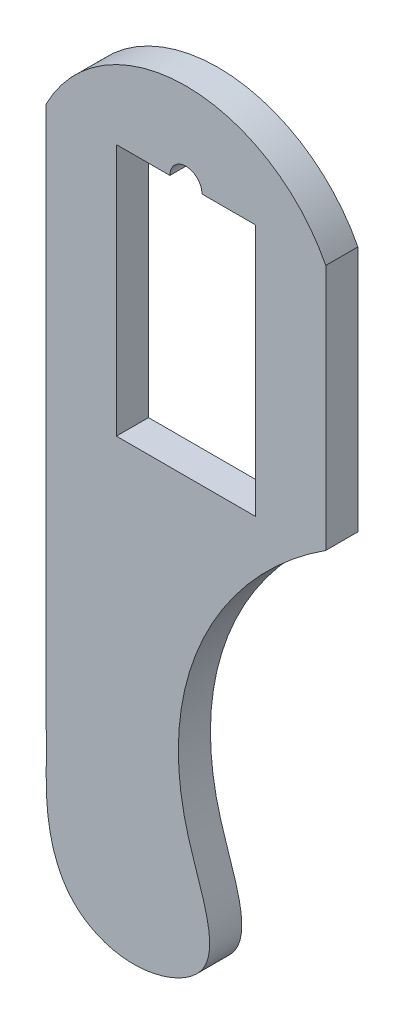
ISO-10303-21;
HEADER;
FILE_DESCRIPTION(('STEP AP214'),'2;1');
FILE_NAME('part.step','',(''),(''),'','','');
FILE_SCHEMA(('AUTOMOTIVE_DESIGN { 1 0 10303 214 1 1 1 1 }'));
ENDSEC;
DATA;
#1=APPLICATION_CONTEXT('core data for automotive mechanical design processes');
#2=APPLICATION_PROTOCOL_DEFINITION('international standard','automotive_design',2000,#1);
#3=PRODUCT_CONTEXT('',#1,'mechanical');
#4=PRODUCT('Part','Part','',(#3));
#5=PRODUCT_RELATED_PRODUCT_CATEGORY('part','',(#4));
#6=PRODUCT_DEFINITION_FORMATION('','',#4);
#7=PRODUCT_DEFINITION_CONTEXT('part definition',#1,'design');
#8=PRODUCT_DEFINITION('design','',#6,#7);
#9=PRODUCT_DEFINITION_SHAPE('','',#8);
#10=(LENGTH_UNIT() NAMED_UNIT(*) SI_UNIT(.MILLI.,.METRE.));
#11=(NAMED_UNIT(*) PLANE_ANGLE_UNIT() SI_UNIT($,.RADIAN.));
#12=(NAMED_UNIT(*) SI_UNIT($,.STERADIAN.) SOLID_ANGLE_UNIT());
#13=UNCERTAINTY_MEASURE_WITH_UNIT(LENGTH_MEASURE(1.E-05),#10,'distance_accuracy_value','');
#14=(GEOMETRIC_REPRESENTATION_CONTEXT(3) GLOBAL_UNCERTAINTY_ASSIGNED_CONTEXT((#13)) GLOBAL_UNIT_ASSIGNED_CONTEXT((#10,
#11,#12)) REPRESENTATION_CONTEXT('',''));
#15=CARTESIAN_POINT('',(0.,0.,0.));
#16=DIRECTION('',(0.,0.,1.));
#17=DIRECTION('',(1.,0.,0.));
#18=AXIS2_PLACEMENT_3D('',#15,#16,#17);
#19=CARTESIAN_POINT('',(0.,5.1250774375,3.));
#20=DIRECTION('',(0.,0.,1.));
#21=DIRECTION('',(1.,0.,0.));
#22=AXIS2_PLACEMENT_3D('',#19,#20,#21);
#23=PLANE('',#22);
#24=CARTESIAN_POINT('',(0.,5.1250774375,3.));
#25=DIRECTION('',(0.,0.,1.));
#26=DIRECTION('',(1.,0.,0.));
#27=AXIS2_PLACEMENT_3D('',#24,#25,#26);
#28=CIRCLE('',#27,14.6749225625);
#29=CARTESIAN_POINT('',(13.069,11.8,3.));
#30=VERTEX_POINT('',#29);
#31=CARTESIAN_POINT('',(-13.069,11.8,3.));
#32=VERTEX_POINT('',#31);
#33=EDGE_CURVE('E161',#30,#32,#28,.T.);
#34=ORIENTED_EDGE('',*,*,#33,.T.);
#35=DIRECTION('',(0.,-1.,0.));
#36=VECTOR('',#35,1.);
#37=CARTESIAN_POINT('',(-13.069,11.8,3.));
#38=LINE('',#37,#36);
#39=CARTESIAN_POINT('',(-13.069,-38.2,3.));
#40=VERTEX_POINT('',#39);
#41=EDGE_CURVE('E164',#32,#40,#38,.T.);
#42=ORIENTED_EDGE('',*,*,#41,.T.);
#43=CARTESIAN_POINT('',(-13.069,-38.2,3.));
#44=CARTESIAN_POINT('',(-12.9510365718167,-40.9543325132562,3.));
#45=CARTESIAN_POINT('',(-13.4632052610735,-45.3956694978515,3.));
#46=CARTESIAN_POINT('',(-11.1701127624396,-52.0502301488085,3.));
#47=CARTESIAN_POINT('',(-4.84185020895898,-54.786907754327,3.));
#48=CARTESIAN_POINT('',(4.62467005644568,-50.9251997111791,3.));
#49=CARTESIAN_POINT('',(-5.38277994610308,-31.829647289569,3.));
#50=CARTESIAN_POINT('',(3.79975941115545,-17.2277462808135,3.));
#51=CARTESIAN_POINT('',(13.069,-11.2692433974346,3.));
#52=B_SPLINE_CURVE_WITH_KNOTS('',3,(#43,#44,#45,#46,#47,#48,#49,#50,#51),.UNSPECIFIED.,.F.,.F.,
(4,1,1,1,1,1,4),(0.,0.116411248027306,0.189880728976028,0.279260210143096,0.381967403176367,
0.52706386837766,1.),.UNSPECIFIED.);
#53=CARTESIAN_POINT('',(13.069,-11.2692433974346,3.));
#54=VERTEX_POINT('',#53);
#55=EDGE_CURVE('E167',#40,#54,#52,.T.);
#56=ORIENTED_EDGE('',*,*,#55,.T.);
#57=DIRECTION('',(0.,1.,0.));
#58=VECTOR('',#57,1.);
#59=CARTESIAN_POINT('',(13.069,-11.2133872825292,3.));
#60=LINE('',#59,#58);
#61=EDGE_CURVE('E172',#54,#30,#60,.T.);
#62=ORIENTED_EDGE('',*,*,#61,.T.);
#63=EDGE_LOOP('',(#34,#42,#56,#62));
#64=FACE_BOUND('',#63,.T.);
#65=DIRECTION('',(-1.,0.,0.));
#66=VECTOR('',#65,1.);
#67=CARTESIAN_POINT('',(1.5,11.8,3.));
#68=LINE('',#67,#66);
#69=CARTESIAN_POINT('',(6.5,11.8,3.));
#70=VERTEX_POINT('',#69);
#71=CARTESIAN_POINT('',(1.5,11.8,3.));
#72=VERTEX_POINT('',#71);
#73=EDGE_CURVE('E118',#70,#72,#68,.T.);
#74=ORIENTED_EDGE('',*,*,#73,.F.);
#75=DIRECTION('',(0.,1.,0.));
#76=VECTOR('',#75,1.);
#77=CARTESIAN_POINT('',(6.5,11.8,3.));
#78=LINE('',#77,#76);
#79=CARTESIAN_POINT('',(6.5,-11.8,3.));
#80=VERTEX_POINT('',#79);
#81=EDGE_CURVE('E110',#80,#70,#78,.T.);
#82=ORIENTED_EDGE('',*,*,#81,.F.);
#83=DIRECTION('',(1.,0.,0.));
#84=VECTOR('',#83,1.);
#85=CARTESIAN_POINT('',(-6.5,-11.8,3.));
#86=LINE('',#85,#84);
#87=CARTESIAN_POINT('',(-6.5,-11.8,3.));
#88=VERTEX_POINT('',#87);
#89=EDGE_CURVE('E139',#88,#80,#86,.T.);
#90=ORIENTED_EDGE('',*,*,#89,.F.);
#91=DIRECTION('',(0.,-1.,0.));
#92=VECTOR('',#91,1.);
#93=CARTESIAN_POINT('',(-6.5,11.8,3.));
#94=LINE('',#93,#92);
#95=CARTESIAN_POINT('',(-6.5,11.8,3.));
#96=VERTEX_POINT('',#95);
#97=EDGE_CURVE('E137',#96,#88,#94,.T.);
#98=ORIENTED_EDGE('',*,*,#97,.F.);
#99=DIRECTION('',(-1.,0.,0.));
#100=VECTOR('',#99,1.);
#101=CARTESIAN_POINT('',(-6.5,11.8,3.));
#102=LINE('',#101,#100);
#103=CARTESIAN_POINT('',(-1.5,11.8,3.));
#104=VERTEX_POINT('',#103);
#105=EDGE_CURVE('E133',#104,#96,#102,.T.);
#106=ORIENTED_EDGE('',*,*,#105,.F.);
#107=CARTESIAN_POINT('',(0.,11.8,3.));
#108=DIRECTION('',(0.,0.,1.));
#109=DIRECTION('',(1.,0.,0.));
#110=AXIS2_PLACEMENT_3D('',#107,#108,#109);
#111=CIRCLE('',#110,1.5);
#112=EDGE_CURVE('E131',#72,#104,#111,.T.);
#113=ORIENTED_EDGE('',*,*,#112,.F.);
#114=EDGE_LOOP('',(#74,#82,#90,#98,#106,#113));
#115=FACE_BOUND('',#114,.T.);
#116=ADVANCED_FACE('F33',(#64,#115),#23,.T.);
#117=CARTESIAN_POINT('',(0.,5.1250774375,0.));
#118=DIRECTION('',(0.,0.,1.));
#119=DIRECTION('',(1.,0.,0.));
#120=AXIS2_PLACEMENT_3D('',#117,#118,#119);
#121=PLANE('',#120);
#122=CARTESIAN_POINT('',(0.,5.1250774375,0.));
#123=DIRECTION('',(0.,0.,1.));
#124=DIRECTION('',(1.,0.,0.));
#125=AXIS2_PLACEMENT_3D('',#122,#123,#124);
#126=CIRCLE('',#125,14.6749225625);
#127=CARTESIAN_POINT('',(13.069,11.8,0.));
#128=VERTEX_POINT('',#127);
#129=CARTESIAN_POINT('',(-13.069,11.8,0.));
#130=VERTEX_POINT('',#129);
#131=EDGE_CURVE('E126',#128,#130,#126,.T.);
#132=ORIENTED_EDGE('',*,*,#131,.F.);
#133=DIRECTION('',(0.,1.,0.));
#134=VECTOR('',#133,1.);
#135=CARTESIAN_POINT('',(13.069,11.8,0.));
#136=LINE('',#135,#134);
#137=CARTESIAN_POINT('',(13.069,-11.2692433974346,0.));
#138=VERTEX_POINT('',#137);
#139=EDGE_CURVE('E165',#138,#128,#136,.T.);
#140=ORIENTED_EDGE('',*,*,#139,.F.);
#141=CARTESIAN_POINT('',(-13.069,-38.2,0.));
#142=CARTESIAN_POINT('',(-12.9510365718167,-40.9543325132562,0.));
#143=CARTESIAN_POINT('',(-13.4632052610735,-45.3956694978515,0.));
#144=CARTESIAN_POINT('',(-11.1701127624396,-52.0502301488085,0.));
#145=CARTESIAN_POINT('',(-4.84185020895898,-54.786907754327,0.));
#146=CARTESIAN_POINT('',(4.62467005644568,-50.9251997111791,0.));
#147=CARTESIAN_POINT('',(-5.38277994610308,-31.829647289569,0.));
#148=CARTESIAN_POINT('',(3.79975941115545,-17.2277462808135,0.));
#149=CARTESIAN_POINT('',(13.069,-11.2692433974346,0.));
#150=B_SPLINE_CURVE_WITH_KNOTS('',3,(#141,#142,#143,#144,#145,#146,#147,#148,#149),
.UNSPECIFIED.,.F.,.F.,(4,1,1,1,1,1,4),(0.,0.116411248027306,0.189880728976028,0.279260210143096,
0.381967403176367,0.52706386837766,1.),.UNSPECIFIED.);
#151=CARTESIAN_POINT('',(-13.069,-38.2,0.));
#152=VERTEX_POINT('',#151);
#153=EDGE_CURVE('E309',#152,#138,#150,.T.);
#154=ORIENTED_EDGE('',*,*,#153,.F.);
#155=DIRECTION('',(0.,-1.,0.));
#156=VECTOR('',#155,1.);
#157=CARTESIAN_POINT('',(-13.069,11.8,0.));
#158=LINE('',#157,#156);
#159=EDGE_CURVE('E314',#130,#152,#158,.T.);
#160=ORIENTED_EDGE('',*,*,#159,.F.);
#161=EDGE_LOOP('',(#132,#140,#154,#160));
#162=FACE_BOUND('',#161,.T.);
#163=DIRECTION('',(0.,1.,0.));
#164=VECTOR('',#163,1.);
#165=CARTESIAN_POINT('',(6.5,11.8,0.));
#166=LINE('',#165,#164);
#167=CARTESIAN_POINT('',(6.5,-11.8,0.));
#168=VERTEX_POINT('',#167);
#169=CARTESIAN_POINT('',(6.5,11.8,0.));
#170=VERTEX_POINT('',#169);
#171=EDGE_CURVE('E56',#168,#170,#166,.T.);
#172=ORIENTED_EDGE('',*,*,#171,.T.);
#173=DIRECTION('',(-1.,0.,0.));
#174=VECTOR('',#173,1.);
#175=CARTESIAN_POINT('',(1.5,11.8,0.));
#176=LINE('',#175,#174);
#177=CARTESIAN_POINT('',(1.5,11.8,0.));
#178=VERTEX_POINT('',#177);
#179=EDGE_CURVE('E125',#170,#178,#176,.T.);
#180=ORIENTED_EDGE('',*,*,#179,.T.);
#181=CARTESIAN_POINT('',(0.,11.8,0.));
#182=DIRECTION('',(0.,0.,1.));
#183=DIRECTION('',(1.,0.,0.));
#184=AXIS2_PLACEMENT_3D('',#181,#182,#183);
#185=CIRCLE('',#184,1.5);
#186=CARTESIAN_POINT('',(-1.5,11.8,0.));
#187=VERTEX_POINT('',#186);
#188=EDGE_CURVE('E143',#178,#187,#185,.T.);
#189=ORIENTED_EDGE('',*,*,#188,.T.);
#190=DIRECTION('',(-1.,0.,0.));
#191=VECTOR('',#190,1.);
#192=CARTESIAN_POINT('',(-6.5,11.8,0.));
#193=LINE('',#192,#191);
#194=CARTESIAN_POINT('',(-6.5,11.8,0.));
#195=VERTEX_POINT('',#194);
#196=EDGE_CURVE('E146',#187,#195,#193,.T.);
#197=ORIENTED_EDGE('',*,*,#196,.T.);
#198=DIRECTION('',(0.,-1.,0.));
#199=VECTOR('',#198,1.);
#200=CARTESIAN_POINT('',(-6.5,11.8,0.));
#201=LINE('',#200,#199);
#202=CARTESIAN_POINT('',(-6.5,-11.8,0.));
#203=VERTEX_POINT('',#202);
#204=EDGE_CURVE('E149',#195,#203,#201,.T.);
#205=ORIENTED_EDGE('',*,*,#204,.T.);
#206=DIRECTION('',(1.,0.,0.));
#207=VECTOR('',#206,1.);
#208=CARTESIAN_POINT('',(-6.5,-11.8,0.));
#209=LINE('',#208,#207);
#210=EDGE_CURVE('E119',#203,#168,#209,.T.);
#211=ORIENTED_EDGE('',*,*,#210,.T.);
#212=EDGE_LOOP('',(#172,#180,#189,#197,#205,#211));
#213=FACE_BOUND('',#212,.T.);
#214=ADVANCED_FACE('F190',(#162,#213),#121,.F.);
#215=CARTESIAN_POINT('',(0.,5.1250774375,3.));
#216=DIRECTION('',(0.,0.,-1.));
#217=DIRECTION('',(-1.,0.,0.));
#218=AXIS2_PLACEMENT_3D('',#215,#216,#217);
#219=CYLINDRICAL_SURFACE('',#218,14.6749225625);
#220=ORIENTED_EDGE('',*,*,#131,.T.);
#221=DIRECTION('',(0.,0.,-1.));
#222=VECTOR('',#221,1.);
#223=CARTESIAN_POINT('',(-13.069,11.8,3.));
#224=LINE('',#223,#222);
#225=EDGE_CURVE('E11',#32,#130,#224,.T.);
#226=ORIENTED_EDGE('',*,*,#225,.F.);
#227=ORIENTED_EDGE('',*,*,#33,.F.);
#228=DIRECTION('',(0.,0.,-1.));
#229=VECTOR('',#228,1.);
#230=CARTESIAN_POINT('',(13.069,11.8,3.));
#231=LINE('',#230,#229);
#232=EDGE_CURVE('E302',#30,#128,#231,.T.);
#233=ORIENTED_EDGE('',*,*,#232,.T.);
#234=EDGE_LOOP('',(#220,#226,#227,#233));
#235=FACE_BOUND('',#234,.T.);
#236=ADVANCED_FACE('F35',(#235),#219,.T.);
#237=CARTESIAN_POINT('',(-13.069,11.8,3.));
#238=DIRECTION('',(1.,0.,0.));
#239=DIRECTION('',(0.,1.,0.));
#240=AXIS2_PLACEMENT_3D('',#237,#238,#239);
#241=PLANE('',#240);
#242=ORIENTED_EDGE('',*,*,#159,.T.);
#243=DIRECTION('',(0.,0.,-1.));
#244=VECTOR('',#243,1.);
#245=CARTESIAN_POINT('',(-13.069,-38.2,3.));
#246=LINE('',#245,#244);
#247=EDGE_CURVE('E41',#40,#152,#246,.T.);
#248=ORIENTED_EDGE('',*,*,#247,.F.);
#249=ORIENTED_EDGE('',*,*,#41,.F.);
#250=ORIENTED_EDGE('',*,*,#225,.T.);
#251=EDGE_LOOP('',(#242,#248,#249,#250));
#252=FACE_BOUND('',#251,.T.);
#253=ADVANCED_FACE('F182',(#252),#241,.F.);
#254=DIRECTION('',(0.,0.,-1.));
#255=VECTOR('',#254,1.);
#256=SURFACE_OF_LINEAR_EXTRUSION('',#52,#255);
#257=ORIENTED_EDGE('',*,*,#153,.T.);
#258=DIRECTION('',(0.,0.,-1.));
#259=VECTOR('',#258,1.);
#260=CARTESIAN_POINT('',(13.069,-11.2692433974346,3.));
#261=LINE('',#260,#259);
#262=EDGE_CURVE('E305',#54,#138,#261,.T.);
#263=ORIENTED_EDGE('',*,*,#262,.F.);
#264=ORIENTED_EDGE('',*,*,#55,.F.);
#265=ORIENTED_EDGE('',*,*,#247,.T.);
#266=EDGE_LOOP('',(#257,#263,#264,#265));
#267=FACE_BOUND('',#266,.T.);
#268=ADVANCED_FACE('F178',(#267),#256,.F.);
#269=CARTESIAN_POINT('',(13.069,11.8,3.));
#270=DIRECTION('',(-1.,0.,0.));
#271=DIRECTION('',(0.,-1.,0.));
#272=AXIS2_PLACEMENT_3D('',#269,#270,#271);
#273=PLANE('',#272);
#274=ORIENTED_EDGE('',*,*,#139,.T.);
#275=ORIENTED_EDGE('',*,*,#232,.F.);
#276=ORIENTED_EDGE('',*,*,#61,.F.);
#277=ORIENTED_EDGE('',*,*,#262,.T.);
#278=EDGE_LOOP('',(#274,#275,#276,#277));
#279=FACE_BOUND('',#278,.T.);
#280=ADVANCED_FACE('F181',(#279),#273,.F.);
#281=CARTESIAN_POINT('',(6.5,11.8,3.));
#282=DIRECTION('',(-1.,0.,0.));
#283=DIRECTION('',(0.,-1.,0.));
#284=AXIS2_PLACEMENT_3D('',#281,#282,#283);
#285=PLANE('',#284);
#286=ORIENTED_EDGE('',*,*,#171,.F.);
#287=DIRECTION('',(0.,0.,-1.));
#288=VECTOR('',#287,1.);
#289=CARTESIAN_POINT('',(6.5,-11.8,3.));
#290=LINE('',#289,#288);
#291=EDGE_CURVE('E114',#80,#168,#290,.T.);
#292=ORIENTED_EDGE('',*,*,#291,.F.);
#293=ORIENTED_EDGE('',*,*,#81,.T.);
#294=DIRECTION('',(0.,0.,-1.));
#295=VECTOR('',#294,1.);
#296=CARTESIAN_POINT('',(6.5,11.8,3.));
#297=LINE('',#296,#295);
#298=EDGE_CURVE('E113',#70,#170,#297,.T.);
#299=ORIENTED_EDGE('',*,*,#298,.T.);
#300=EDGE_LOOP('',(#286,#292,#293,#299));
#301=FACE_BOUND('',#300,.T.);
#302=ADVANCED_FACE('F112',(#301),#285,.T.);
#303=CARTESIAN_POINT('',(1.5,11.8,3.));
#304=DIRECTION('',(0.,-1.,0.));
#305=DIRECTION('',(0.,0.,-1.));
#306=AXIS2_PLACEMENT_3D('',#303,#304,#305);
#307=PLANE('',#306);
#308=ORIENTED_EDGE('',*,*,#179,.F.);
#309=ORIENTED_EDGE('',*,*,#298,.F.);
#310=ORIENTED_EDGE('',*,*,#73,.T.);
#311=DIRECTION('',(0.,0.,-1.));
#312=VECTOR('',#311,1.);
#313=CARTESIAN_POINT('',(1.5,11.8,3.));
#314=LINE('',#313,#312);
#315=EDGE_CURVE('E127',#72,#178,#314,.T.);
#316=ORIENTED_EDGE('',*,*,#315,.T.);
#317=EDGE_LOOP('',(#308,#309,#310,#316));
#318=FACE_BOUND('',#317,.T.);
#319=ADVANCED_FACE('F122',(#318),#307,.T.);
#320=CARTESIAN_POINT('',(0.,11.8,3.));
#321=DIRECTION('',(0.,0.,-1.));
#322=DIRECTION('',(-1.,0.,0.));
#323=AXIS2_PLACEMENT_3D('',#320,#321,#322);
#324=CYLINDRICAL_SURFACE('',#323,1.5);
#325=ORIENTED_EDGE('',*,*,#188,.F.);
#326=ORIENTED_EDGE('',*,*,#315,.F.);
#327=ORIENTED_EDGE('',*,*,#112,.T.);
#328=DIRECTION('',(0.,0.,-1.));
#329=VECTOR('',#328,1.);
#330=CARTESIAN_POINT('',(-1.5,11.8,3.));
#331=LINE('',#330,#329);
#332=EDGE_CURVE('E158',#104,#187,#331,.T.);
#333=ORIENTED_EDGE('',*,*,#332,.T.);
#334=EDGE_LOOP('',(#325,#326,#327,#333));
#335=FACE_BOUND('',#334,.T.);
#336=ADVANCED_FACE('F204',(#335),#324,.F.);
#337=CARTESIAN_POINT('',(-6.5,11.8,3.));
#338=DIRECTION('',(0.,-1.,0.));
#339=DIRECTION('',(0.,0.,-1.));
#340=AXIS2_PLACEMENT_3D('',#337,#338,#339);
#341=PLANE('',#340);
#342=ORIENTED_EDGE('',*,*,#196,.F.);
#343=ORIENTED_EDGE('',*,*,#332,.F.);
#344=ORIENTED_EDGE('',*,*,#105,.T.);
#345=DIRECTION('',(0.,0.,-1.));
#346=VECTOR('',#345,1.);
#347=CARTESIAN_POINT('',(-6.5,11.8,3.));
#348=LINE('',#347,#346);
#349=EDGE_CURVE('E156',#96,#195,#348,.T.);
#350=ORIENTED_EDGE('',*,*,#349,.T.);
#351=EDGE_LOOP('',(#342,#343,#344,#350));
#352=FACE_BOUND('',#351,.T.);
#353=ADVANCED_FACE('F207',(#352),#341,.T.);
#354=CARTESIAN_POINT('',(-6.5,11.8,3.));
#355=DIRECTION('',(1.,0.,0.));
#356=DIRECTION('',(0.,1.,0.));
#357=AXIS2_PLACEMENT_3D('',#354,#355,#356);
#358=PLANE('',#357);
#359=ORIENTED_EDGE('',*,*,#204,.F.);
#360=ORIENTED_EDGE('',*,*,#349,.F.);
#361=ORIENTED_EDGE('',*,*,#97,.T.);
#362=DIRECTION('',(0.,0.,-1.));
#363=VECTOR('',#362,1.);
#364=CARTESIAN_POINT('',(-6.5,-11.8,3.));
#365=LINE('',#364,#363);
#366=EDGE_CURVE('E48',#88,#203,#365,.T.);
#367=ORIENTED_EDGE('',*,*,#366,.T.);
#368=EDGE_LOOP('',(#359,#360,#361,#367));
#369=FACE_BOUND('',#368,.T.);
#370=ADVANCED_FACE('F211',(#369),#358,.T.);
#371=CARTESIAN_POINT('',(-6.5,-11.8,3.));
#372=DIRECTION('',(0.,1.,0.));
#373=DIRECTION('',(0.,0.,1.));
#374=AXIS2_PLACEMENT_3D('',#371,#372,#373);
#375=PLANE('',#374);
#376=ORIENTED_EDGE('',*,*,#210,.F.);
#377=ORIENTED_EDGE('',*,*,#366,.F.);
#378=ORIENTED_EDGE('',*,*,#89,.T.);
#379=ORIENTED_EDGE('',*,*,#291,.T.);
#380=EDGE_LOOP('',(#376,#377,#378,#379));
#381=FACE_BOUND('',#380,.T.);
#382=ADVANCED_FACE('F215',(#381),#375,.T.);
#383=CLOSED_SHELL('',(#116,#214,#236,#253,#268,#280,#302,#319,#336,#353,#370,#382));
#384=MANIFOLD_SOLID_BREP('B2',#383);
#385=ADVANCED_BREP_SHAPE_REPRESENTATION('',(#18,#384),#14);
#386=SHAPE_DEFINITION_REPRESENTATION(#9,#385);
ENDSEC;
END-ISO-10303-21;
